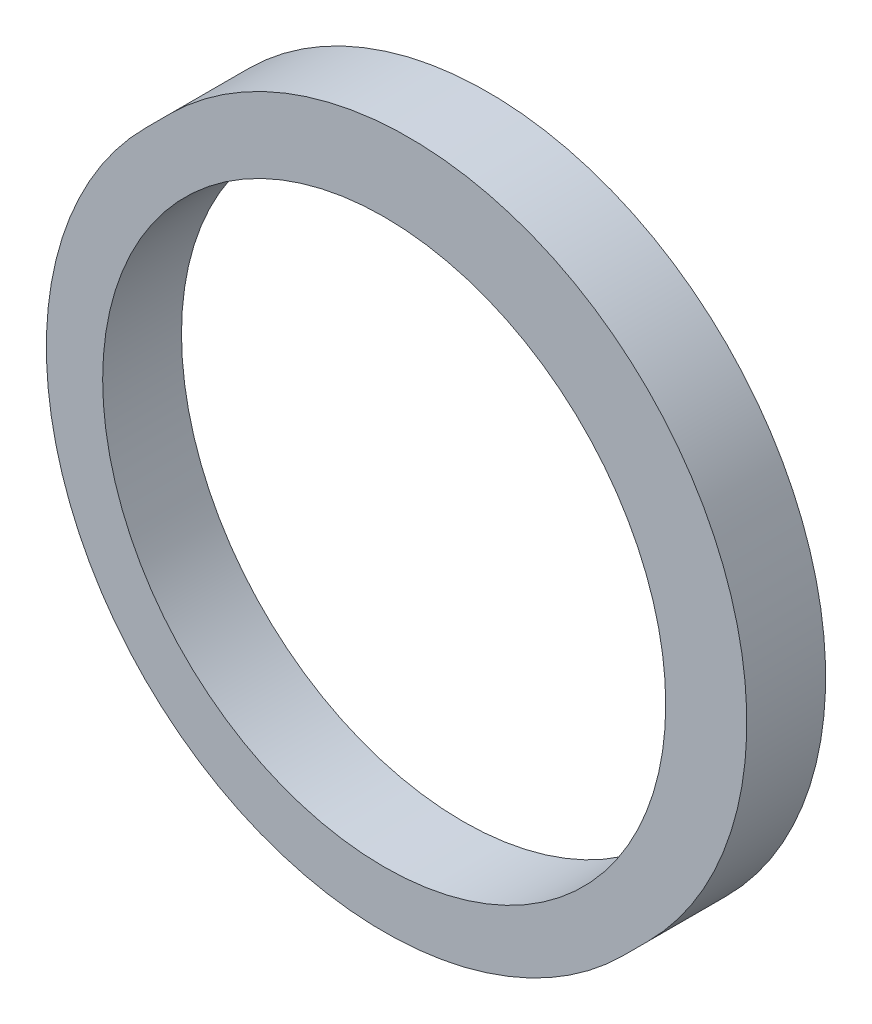
ISO-10303-21;
HEADER;
FILE_DESCRIPTION(('STEP AP214'),'2;1');
FILE_NAME('part.step','',(''),(''),'','','');
FILE_SCHEMA(('AUTOMOTIVE_DESIGN { 1 0 10303 214 1 1 1 1 }'));
ENDSEC;
DATA;
#1=APPLICATION_CONTEXT('core data for automotive mechanical design processes');
#2=APPLICATION_PROTOCOL_DEFINITION('international standard','automotive_design',2000,#1);
#3=PRODUCT_CONTEXT('',#1,'mechanical');
#4=PRODUCT('Part','Part','',(#3));
#5=PRODUCT_RELATED_PRODUCT_CATEGORY('part','',(#4));
#6=PRODUCT_DEFINITION_FORMATION('','',#4);
#7=PRODUCT_DEFINITION_CONTEXT('part definition',#1,'design');
#8=PRODUCT_DEFINITION('design','',#6,#7);
#9=PRODUCT_DEFINITION_SHAPE('','',#8);
#10=(LENGTH_UNIT() NAMED_UNIT(*) SI_UNIT(.MILLI.,.METRE.));
#11=(NAMED_UNIT(*) PLANE_ANGLE_UNIT() SI_UNIT($,.RADIAN.));
#12=(NAMED_UNIT(*) SI_UNIT($,.STERADIAN.) SOLID_ANGLE_UNIT());
#13=UNCERTAINTY_MEASURE_WITH_UNIT(LENGTH_MEASURE(1.E-05),#10,'distance_accuracy_value','');
#14=(GEOMETRIC_REPRESENTATION_CONTEXT(3) GLOBAL_UNCERTAINTY_ASSIGNED_CONTEXT((#13)) GLOBAL_UNIT_ASSIGNED_CONTEXT((#10,
#11,#12)) REPRESENTATION_CONTEXT('',''));
#15=CARTESIAN_POINT('',(0.,0.,0.));
#16=DIRECTION('',(0.,0.,1.));
#17=DIRECTION('',(1.,0.,0.));
#18=AXIS2_PLACEMENT_3D('',#15,#16,#17);
#19=CARTESIAN_POINT('',(127.37,-112.51,-0.045));
#20=DIRECTION('',(0.,0.,-1.));
#21=DIRECTION('',(0.,-1.,0.));
#22=AXIS2_PLACEMENT_3D('',#19,#20,#21);
#23=CYLINDRICAL_SURFACE('',#22,0.125);
#24=CARTESIAN_POINT('',(127.37,-112.51,1.6));
#25=DIRECTION('',(0.,0.,-1.));
#26=DIRECTION('',(0.,-1.,0.));
#27=AXIS2_PLACEMENT_3D('',#24,#25,#26);
#28=CIRCLE('',#27,0.125);
#29=CARTESIAN_POINT('',(127.37,-112.635,1.6));
#30=VERTEX_POINT('',#29);
#31=EDGE_CURVE('E115',#30,#30,#28,.T.);
#32=ORIENTED_EDGE('',*,*,#31,.T.);
#33=DIRECTION('',(0.,0.,1.));
#34=VECTOR('',#33,1.);
#35=CARTESIAN_POINT('',(127.37,-112.635,-0.045));
#36=LINE('',#35,#34);
#37=CARTESIAN_POINT('',(127.37,-112.635,1.635));
#38=VERTEX_POINT('',#37);
#39=EDGE_CURVE('E11',#30,#38,#36,.T.);
#40=ORIENTED_EDGE('',*,*,#39,.T.);
#41=CARTESIAN_POINT('',(127.37,-112.51,1.635));
#42=DIRECTION('',(0.,0.,-1.));
#43=DIRECTION('',(0.,-1.,0.));
#44=AXIS2_PLACEMENT_3D('',#41,#42,#43);
#45=CIRCLE('',#44,0.125);
#46=EDGE_CURVE('E20',#38,#38,#45,.T.);
#47=ORIENTED_EDGE('',*,*,#46,.F.);
#48=ORIENTED_EDGE('',*,*,#39,.F.);
#49=EDGE_LOOP('',(#32,#40,#47,#48));
#50=FACE_BOUND('',#49,.T.);
#51=ADVANCED_FACE('F17',(#50),#23,.F.);
#52=CARTESIAN_POINT('',(127.476066,-112.616066,1.6));
#53=DIRECTION('',(-0.707106781187048,0.707106781186048,0.));
#54=DIRECTION('',(0.,0.,1.));
#55=AXIS2_PLACEMENT_3D('',#52,#53,#54);
#56=PLANE('',#55);
#57=DIRECTION('',(0.707106781186048,0.707106781187048,0.));
#58=VECTOR('',#57,1.);
#59=CARTESIAN_POINT('',(127.476066,-112.616066,1.6));
#60=LINE('',#59,#58);
#61=CARTESIAN_POINT('',(127.476066,-112.616066,1.6));
#62=VERTEX_POINT('',#61);
#63=CARTESIAN_POINT('',(127.487066,-112.605066,1.6));
#64=VERTEX_POINT('',#63);
#65=EDGE_CURVE('E112',#62,#64,#60,.T.);
#66=ORIENTED_EDGE('',*,*,#65,.T.);
#67=DIRECTION('',(0.,0.,1.));
#68=VECTOR('',#67,1.);
#69=CARTESIAN_POINT('',(127.487066,-112.605066,1.6));
#70=LINE('',#69,#68);
#71=CARTESIAN_POINT('',(127.487066,-112.605066,1.635));
#72=VERTEX_POINT('',#71);
#73=EDGE_CURVE('E84',#64,#72,#70,.T.);
#74=ORIENTED_EDGE('',*,*,#73,.T.);
#75=DIRECTION('',(0.707106781186048,0.707106781187048,0.));
#76=VECTOR('',#75,1.);
#77=CARTESIAN_POINT('',(127.476066,-112.616066,1.635));
#78=LINE('',#77,#76);
#79=CARTESIAN_POINT('',(127.476066,-112.616066,1.635));
#80=VERTEX_POINT('',#79);
#81=EDGE_CURVE('E133',#80,#72,#78,.T.);
#82=ORIENTED_EDGE('',*,*,#81,.F.);
#83=DIRECTION('',(0.,0.,1.));
#84=VECTOR('',#83,1.);
#85=CARTESIAN_POINT('',(127.476066,-112.616066,1.6));
#86=LINE('',#85,#84);
#87=EDGE_CURVE('E119',#62,#80,#86,.T.);
#88=ORIENTED_EDGE('',*,*,#87,.F.);
#89=EDGE_LOOP('',(#66,#74,#82,#88));
#90=FACE_BOUND('',#89,.T.);
#91=ADVANCED_FACE('F145',(#90),#56,.F.);
#92=CARTESIAN_POINT('',(127.274933,-112.392933,1.635));
#93=DIRECTION('',(0.,0.,1.));
#94=DIRECTION('',(1.,0.,0.));
#95=AXIS2_PLACEMENT_3D('',#92,#93,#94);
#96=PLANE('',#95);
#97=ORIENTED_EDGE('',*,*,#46,.T.);
#98=EDGE_LOOP('',(#97));
#99=FACE_BOUND('',#98,.T.);
#100=DIRECTION('',(-0.707106781187048,-0.707106781186048,0.));
#101=VECTOR('',#100,1.);
#102=CARTESIAN_POINT('',(127.274933,-112.392933,1.635));
#103=LINE('',#102,#101);
#104=CARTESIAN_POINT('',(127.274933,-112.392933,1.635));
#105=VERTEX_POINT('',#104);
#106=CARTESIAN_POINT('',(127.263933,-112.403933,1.635));
#107=VERTEX_POINT('',#106);
#108=EDGE_CURVE('E96',#105,#107,#103,.T.);
#109=ORIENTED_EDGE('',*,*,#108,.T.);
#110=CARTESIAN_POINT('',(127.3699995,-112.5099995,1.635));
#111=DIRECTION('',(0.,0.,1.));
#112=DIRECTION('',(-0.707106781186548,0.707106781186548,0.));
#113=AXIS2_PLACEMENT_3D('',#110,#111,#112);
#114=CIRCLE('',#113,0.150000682813);
#115=EDGE_CURVE('E116',#107,#80,#114,.T.);
#116=ORIENTED_EDGE('',*,*,#115,.T.);
#117=ORIENTED_EDGE('',*,*,#81,.T.);
#118=CARTESIAN_POINT('',(127.3809995,-112.4989995,1.635));
#119=DIRECTION('',(0.,0.,1.));
#120=DIRECTION('',(0.707106781186548,-0.707106781186548,0.));
#121=AXIS2_PLACEMENT_3D('',#118,#119,#120);
#122=CIRCLE('',#121,0.150000682813);
#123=EDGE_CURVE('E88',#72,#105,#122,.T.);
#124=ORIENTED_EDGE('',*,*,#123,.T.);
#125=EDGE_LOOP('',(#109,#116,#117,#124));
#126=FACE_BOUND('',#125,.T.);
#127=ADVANCED_FACE('F142',(#99,#126),#96,.T.);
#128=CARTESIAN_POINT('',(127.274933,-112.392933,1.6));
#129=DIRECTION('',(0.,0.,1.));
#130=DIRECTION('',(1.,0.,0.));
#131=AXIS2_PLACEMENT_3D('',#128,#129,#130);
#132=PLANE('',#131);
#133=ORIENTED_EDGE('',*,*,#31,.F.);
#134=EDGE_LOOP('',(#133));
#135=FACE_BOUND('',#134,.T.);
#136=CARTESIAN_POINT('',(127.3809995,-112.4989995,1.6));
#137=DIRECTION('',(0.,0.,1.));
#138=DIRECTION('',(0.707106781186548,-0.707106781186548,0.));
#139=AXIS2_PLACEMENT_3D('',#136,#137,#138);
#140=CIRCLE('',#139,0.150000682813);
#141=CARTESIAN_POINT('',(127.274933,-112.392933,1.6));
#142=VERTEX_POINT('',#141);
#143=EDGE_CURVE('E77',#64,#142,#140,.T.);
#144=ORIENTED_EDGE('',*,*,#143,.F.);
#145=ORIENTED_EDGE('',*,*,#65,.F.);
#146=CARTESIAN_POINT('',(127.3699995,-112.5099995,1.6));
#147=DIRECTION('',(0.,0.,1.));
#148=DIRECTION('',(-0.707106781186548,0.707106781186548,0.));
#149=AXIS2_PLACEMENT_3D('',#146,#147,#148);
#150=CIRCLE('',#149,0.150000682813);
#151=CARTESIAN_POINT('',(127.263933,-112.403933,1.6));
#152=VERTEX_POINT('',#151);
#153=EDGE_CURVE('E101',#152,#62,#150,.T.);
#154=ORIENTED_EDGE('',*,*,#153,.F.);
#155=DIRECTION('',(-0.707106781187048,-0.707106781186048,0.));
#156=VECTOR('',#155,1.);
#157=CARTESIAN_POINT('',(127.274933,-112.392933,1.6));
#158=LINE('',#157,#156);
#159=EDGE_CURVE('E94',#142,#152,#158,.T.);
#160=ORIENTED_EDGE('',*,*,#159,.F.);
#161=EDGE_LOOP('',(#144,#145,#154,#160));
#162=FACE_BOUND('',#161,.T.);
#163=ADVANCED_FACE('F99',(#135,#162),#132,.F.);
#164=CARTESIAN_POINT('',(127.3699995,-112.5099995,1.6));
#165=DIRECTION('',(0.,0.,-1.));
#166=DIRECTION('',(-0.707106781186548,0.707106781186548,0.));
#167=AXIS2_PLACEMENT_3D('',#164,#165,#166);
#168=CYLINDRICAL_SURFACE('',#167,0.150000682813);
#169=ORIENTED_EDGE('',*,*,#153,.T.);
#170=ORIENTED_EDGE('',*,*,#87,.T.);
#171=ORIENTED_EDGE('',*,*,#115,.F.);
#172=DIRECTION('',(0.,0.,1.));
#173=VECTOR('',#172,1.);
#174=CARTESIAN_POINT('',(127.263933,-112.403933,1.6));
#175=LINE('',#174,#173);
#176=EDGE_CURVE('E104',#152,#107,#175,.T.);
#177=ORIENTED_EDGE('',*,*,#176,.F.);
#178=EDGE_LOOP('',(#169,#170,#171,#177));
#179=FACE_BOUND('',#178,.T.);
#180=ADVANCED_FACE('F160',(#179),#168,.T.);
#181=CARTESIAN_POINT('',(127.3809995,-112.4989995,1.6));
#182=DIRECTION('',(0.,0.,-1.));
#183=DIRECTION('',(0.707106781186548,-0.707106781186548,0.));
#184=AXIS2_PLACEMENT_3D('',#181,#182,#183);
#185=CYLINDRICAL_SURFACE('',#184,0.150000682813);
#186=ORIENTED_EDGE('',*,*,#143,.T.);
#187=DIRECTION('',(0.,0.,1.));
#188=VECTOR('',#187,1.);
#189=CARTESIAN_POINT('',(127.274933,-112.392933,1.6));
#190=LINE('',#189,#188);
#191=EDGE_CURVE('E81',#142,#105,#190,.T.);
#192=ORIENTED_EDGE('',*,*,#191,.T.);
#193=ORIENTED_EDGE('',*,*,#123,.F.);
#194=ORIENTED_EDGE('',*,*,#73,.F.);
#195=EDGE_LOOP('',(#186,#192,#193,#194));
#196=FACE_BOUND('',#195,.T.);
#197=ADVANCED_FACE('F79',(#196),#185,.T.);
#198=CARTESIAN_POINT('',(127.274933,-112.392933,1.6));
#199=DIRECTION('',(0.707106781186048,-0.707106781187048,0.));
#200=DIRECTION('',(0.,0.,-1.));
#201=AXIS2_PLACEMENT_3D('',#198,#199,#200);
#202=PLANE('',#201);
#203=ORIENTED_EDGE('',*,*,#159,.T.);
#204=ORIENTED_EDGE('',*,*,#176,.T.);
#205=ORIENTED_EDGE('',*,*,#108,.F.);
#206=ORIENTED_EDGE('',*,*,#191,.F.);
#207=EDGE_LOOP('',(#203,#204,#205,#206));
#208=FACE_BOUND('',#207,.T.);
#209=ADVANCED_FACE('F92',(#208),#202,.F.);
#210=CLOSED_SHELL('',(#51,#91,#127,#163,#180,#197,#209));
#211=MANIFOLD_SOLID_BREP('B1',#210);
#212=ADVANCED_BREP_SHAPE_REPRESENTATION('',(#18,#211),#14);
#213=SHAPE_DEFINITION_REPRESENTATION(#9,#212);
ENDSEC;
END-ISO-10303-21;
